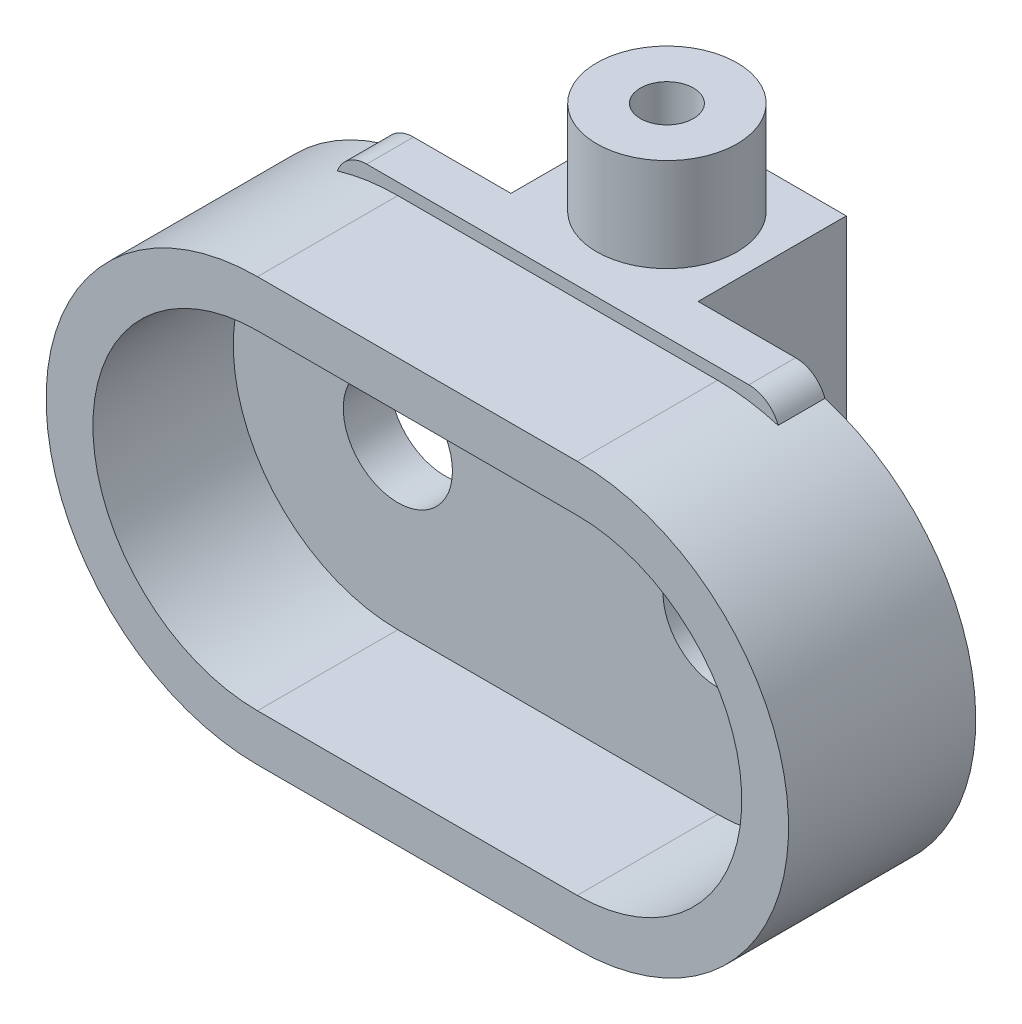
ISO-10303-21;
HEADER;
FILE_DESCRIPTION(('STEP AP214'),'2;1');
FILE_NAME('part.step','',(''),(''),'','','');
FILE_SCHEMA(('AUTOMOTIVE_DESIGN { 1 0 10303 214 1 1 1 1 }'));
ENDSEC;
DATA;
#1=APPLICATION_CONTEXT('core data for automotive mechanical design processes');
#2=APPLICATION_PROTOCOL_DEFINITION('international standard','automotive_design',2000,#1);
#3=PRODUCT_CONTEXT('',#1,'mechanical');
#4=PRODUCT('Part','Part','',(#3));
#5=PRODUCT_RELATED_PRODUCT_CATEGORY('part','',(#4));
#6=PRODUCT_DEFINITION_FORMATION('','',#4);
#7=PRODUCT_DEFINITION_CONTEXT('part definition',#1,'design');
#8=PRODUCT_DEFINITION('design','',#6,#7);
#9=PRODUCT_DEFINITION_SHAPE('','',#8);
#10=(LENGTH_UNIT() NAMED_UNIT(*) SI_UNIT(.MILLI.,.METRE.));
#11=(NAMED_UNIT(*) PLANE_ANGLE_UNIT() SI_UNIT($,.RADIAN.));
#12=(NAMED_UNIT(*) SI_UNIT($,.STERADIAN.) SOLID_ANGLE_UNIT());
#13=UNCERTAINTY_MEASURE_WITH_UNIT(LENGTH_MEASURE(1.E-05),#10,'distance_accuracy_value','');
#14=(GEOMETRIC_REPRESENTATION_CONTEXT(3) GLOBAL_UNCERTAINTY_ASSIGNED_CONTEXT((#13)) GLOBAL_UNIT_ASSIGNED_CONTEXT((#10,
#11,#12)) REPRESENTATION_CONTEXT('',''));
#15=CARTESIAN_POINT('',(0.,0.,0.));
#16=DIRECTION('',(0.,0.,1.));
#17=DIRECTION('',(1.,0.,0.));
#18=AXIS2_PLACEMENT_3D('',#15,#16,#17);
#19=CARTESIAN_POINT('',(136.,508.5,449.72));
#20=DIRECTION('',(0.,-1.,0.));
#21=DIRECTION('',(0.,0.,-1.));
#22=AXIS2_PLACEMENT_3D('',#19,#20,#21);
#23=PLANE('',#22);
#24=CARTESIAN_POINT('',(136.,508.5,449.72));
#25=DIRECTION('',(0.,-1.,0.));
#26=DIRECTION('',(1.,0.,0.));
#27=AXIS2_PLACEMENT_3D('',#24,#25,#26);
#28=CIRCLE('',#27,1.7);
#29=CARTESIAN_POINT('',(137.7,508.5,449.72));
#30=VERTEX_POINT('',#29);
#31=EDGE_CURVE('E24',#30,#30,#28,.T.);
#32=ORIENTED_EDGE('',*,*,#31,.F.);
#33=EDGE_LOOP('',(#32));
#34=FACE_BOUND('',#33,.T.);
#35=ADVANCED_FACE('F15',(#34),#23,.F.);
#36=CARTESIAN_POINT('',(136.,508.5,449.72));
#37=DIRECTION('',(0.,-1.,0.));
#38=DIRECTION('',(1.,0.,0.));
#39=AXIS2_PLACEMENT_3D('',#36,#37,#38);
#40=CYLINDRICAL_SURFACE('',#39,1.7);
#41=DIRECTION('',(0.,1.,0.));
#42=VECTOR('',#41,1.);
#43=CARTESIAN_POINT('',(137.7,508.5,449.72));
#44=LINE('',#43,#42);
#45=CARTESIAN_POINT('',(137.7,513.5,449.72));
#46=VERTEX_POINT('',#45);
#47=CARTESIAN_POINT('',(137.7,524.69,449.72));
#48=VERTEX_POINT('',#47);
#49=EDGE_CURVE('E9',#46,#48,#44,.T.);
#50=ORIENTED_EDGE('',*,*,#49,.T.);
#51=CARTESIAN_POINT('',(136.,524.69,449.72));
#52=DIRECTION('',(0.,-1.,0.));
#53=DIRECTION('',(1.,0.,0.));
#54=AXIS2_PLACEMENT_3D('',#51,#52,#53);
#55=CIRCLE('',#54,1.7);
#56=EDGE_CURVE('E161',#48,#48,#55,.T.);
#57=ORIENTED_EDGE('',*,*,#56,.F.);
#58=ORIENTED_EDGE('',*,*,#49,.F.);
#59=CARTESIAN_POINT('',(136.,513.5,449.72));
#60=DIRECTION('',(0.,-1.,0.));
#61=DIRECTION('',(1.,0.,0.));
#62=AXIS2_PLACEMENT_3D('',#59,#60,#61);
#63=CIRCLE('',#62,1.7);
#64=EDGE_CURVE('E162',#46,#46,#63,.T.);
#65=ORIENTED_EDGE('',*,*,#64,.T.);
#66=EDGE_LOOP('',(#50,#57,#58,#65));
#67=FACE_BOUND('',#66,.T.);
#68=ADVANCED_FACE('F17',(#67),#40,.F.);
#69=CARTESIAN_POINT('',(136.,508.5,449.72));
#70=DIRECTION('',(0.,-1.,0.));
#71=DIRECTION('',(1.,0.,0.));
#72=AXIS2_PLACEMENT_3D('',#69,#70,#71);
#73=CYLINDRICAL_SURFACE('',#72,1.7);
#74=CARTESIAN_POINT('',(136.,510.9,449.72));
#75=DIRECTION('',(0.,-1.,0.));
#76=DIRECTION('',(1.,0.,0.));
#77=AXIS2_PLACEMENT_3D('',#74,#75,#76);
#78=CIRCLE('',#77,1.7);
#79=CARTESIAN_POINT('',(137.7,510.9,449.72));
#80=VERTEX_POINT('',#79);
#81=EDGE_CURVE('E410',#80,#80,#78,.T.);
#82=ORIENTED_EDGE('',*,*,#81,.F.);
#83=DIRECTION('',(0.,1.,0.));
#84=VECTOR('',#83,1.);
#85=CARTESIAN_POINT('',(137.7,508.5,449.72));
#86=LINE('',#85,#84);
#87=EDGE_CURVE('E278',#30,#80,#86,.T.);
#88=ORIENTED_EDGE('',*,*,#87,.F.);
#89=ORIENTED_EDGE('',*,*,#31,.T.);
#90=ORIENTED_EDGE('',*,*,#87,.T.);
#91=EDGE_LOOP('',(#82,#88,#89,#90));
#92=FACE_BOUND('',#91,.T.);
#93=ADVANCED_FACE('F428',(#92),#73,.F.);
#94=CARTESIAN_POINT('',(133.1,510.9,453.12));
#95=DIRECTION('',(0.,0.,1.));
#96=DIRECTION('',(1.,0.,0.));
#97=AXIS2_PLACEMENT_3D('',#94,#95,#96);
#98=PLANE('',#97);
#99=DIRECTION('',(1.,0.,0.));
#100=VECTOR('',#99,1.);
#101=CARTESIAN_POINT('',(133.1,513.5,453.12));
#102=LINE('',#101,#100);
#103=CARTESIAN_POINT('',(133.1,513.5,453.12));
#104=VERTEX_POINT('',#103);
#105=CARTESIAN_POINT('',(138.9,513.5,453.12));
#106=VERTEX_POINT('',#105);
#107=EDGE_CURVE('E153',#104,#106,#102,.T.);
#108=ORIENTED_EDGE('',*,*,#107,.T.);
#109=DIRECTION('',(0.,1.,0.));
#110=VECTOR('',#109,1.);
#111=CARTESIAN_POINT('',(138.9,510.9,453.12));
#112=LINE('',#111,#110);
#113=CARTESIAN_POINT('',(138.9,510.9,453.12));
#114=VERTEX_POINT('',#113);
#115=EDGE_CURVE('E183',#114,#106,#112,.T.);
#116=ORIENTED_EDGE('',*,*,#115,.F.);
#117=DIRECTION('',(1.,0.,0.));
#118=VECTOR('',#117,1.);
#119=CARTESIAN_POINT('',(133.1,510.9,453.12));
#120=LINE('',#119,#118);
#121=CARTESIAN_POINT('',(133.1,510.9,453.12));
#122=VERTEX_POINT('',#121);
#123=EDGE_CURVE('E156',#122,#114,#120,.T.);
#124=ORIENTED_EDGE('',*,*,#123,.F.);
#125=DIRECTION('',(0.,1.,0.));
#126=VECTOR('',#125,1.);
#127=CARTESIAN_POINT('',(133.1,510.9,453.12));
#128=LINE('',#127,#126);
#129=EDGE_CURVE('E148',#122,#104,#128,.T.);
#130=ORIENTED_EDGE('',*,*,#129,.T.);
#131=EDGE_LOOP('',(#108,#116,#124,#130));
#132=FACE_BOUND('',#131,.T.);
#133=ADVANCED_FACE('F150',(#132),#98,.F.);
#134=CARTESIAN_POINT('',(146.25,504.39,456.72));
#135=DIRECTION('',(0.,0.,-1.));
#136=DIRECTION('',(1.,0.,0.));
#137=AXIS2_PLACEMENT_3D('',#134,#135,#136);
#138=CYLINDRICAL_SURFACE('',#137,10.55);
#139=CARTESIAN_POINT('',(146.25,504.39,465.72));
#140=DIRECTION('',(0.,0.,-1.));
#141=DIRECTION('',(-0.97156398104261,0.236777175294905,0.));
#142=AXIS2_PLACEMENT_3D('',#139,#140,#141);
#143=CIRCLE('',#142,10.55);
#144=CARTESIAN_POINT('',(146.25,514.94,465.72));
#145=VERTEX_POINT('',#144);
#146=CARTESIAN_POINT('',(146.25,493.84,465.72));
#147=VERTEX_POINT('',#146);
#148=EDGE_CURVE('E337',#145,#147,#143,.T.);
#149=ORIENTED_EDGE('',*,*,#148,.F.);
#150=DIRECTION('',(0.,0.,1.));
#151=VECTOR('',#150,1.);
#152=CARTESIAN_POINT('',(146.25,514.94,456.72));
#153=LINE('',#152,#151);
#154=CARTESIAN_POINT('',(146.25,514.94,456.72));
#155=VERTEX_POINT('',#154);
#156=EDGE_CURVE('E411',#155,#145,#153,.T.);
#157=ORIENTED_EDGE('',*,*,#156,.F.);
#158=CARTESIAN_POINT('',(146.25,504.39,456.72));
#159=DIRECTION('',(0.,0.,1.));
#160=DIRECTION('',(-0.97156398104261,-0.236777175294905,0.));
#161=AXIS2_PLACEMENT_3D('',#158,#159,#160);
#162=CIRCLE('',#161,10.55);
#163=CARTESIAN_POINT('',(146.25,493.84,456.72));
#164=VERTEX_POINT('',#163);
#165=EDGE_CURVE('E203',#164,#155,#162,.T.);
#166=ORIENTED_EDGE('',*,*,#165,.F.);
#167=DIRECTION('',(0.,0.,1.));
#168=VECTOR('',#167,1.);
#169=CARTESIAN_POINT('',(146.25,493.84,456.72));
#170=LINE('',#169,#168);
#171=EDGE_CURVE('E274',#164,#147,#170,.T.);
#172=ORIENTED_EDGE('',*,*,#171,.T.);
#173=EDGE_LOOP('',(#149,#157,#166,#172));
#174=FACE_BOUND('',#173,.T.);
#175=ADVANCED_FACE('F583',(#174),#138,.F.);
#176=CARTESIAN_POINT('',(125.75,493.84,456.72));
#177=DIRECTION('',(0.,1.,0.));
#178=DIRECTION('',(1.,0.,0.));
#179=AXIS2_PLACEMENT_3D('',#176,#177,#178);
#180=PLANE('',#179);
#181=ORIENTED_EDGE('',*,*,#171,.F.);
#182=DIRECTION('',(1.,0.,0.));
#183=VECTOR('',#182,1.);
#184=CARTESIAN_POINT('',(125.75,493.84,456.72));
#185=LINE('',#184,#183);
#186=CARTESIAN_POINT('',(125.75,493.84,456.72));
#187=VERTEX_POINT('',#186);
#188=EDGE_CURVE('E399',#187,#164,#185,.T.);
#189=ORIENTED_EDGE('',*,*,#188,.F.);
#190=DIRECTION('',(0.,0.,1.));
#191=VECTOR('',#190,1.);
#192=CARTESIAN_POINT('',(125.75,493.84,456.72));
#193=LINE('',#192,#191);
#194=CARTESIAN_POINT('',(125.75,493.84,465.72));
#195=VERTEX_POINT('',#194);
#196=EDGE_CURVE('E279',#187,#195,#193,.T.);
#197=ORIENTED_EDGE('',*,*,#196,.T.);
#198=DIRECTION('',(-1.,0.,0.));
#199=VECTOR('',#198,1.);
#200=CARTESIAN_POINT('',(125.75,493.84,465.72));
#201=LINE('',#200,#199);
#202=EDGE_CURVE('E389',#147,#195,#201,.T.);
#203=ORIENTED_EDGE('',*,*,#202,.F.);
#204=EDGE_LOOP('',(#181,#189,#197,#203));
#205=FACE_BOUND('',#204,.T.);
#206=ADVANCED_FACE('F586',(#205),#180,.T.);
#207=CARTESIAN_POINT('',(125.75,504.39,456.72));
#208=DIRECTION('',(0.,0.,-1.));
#209=DIRECTION('',(1.,0.,0.));
#210=AXIS2_PLACEMENT_3D('',#207,#208,#209);
#211=CYLINDRICAL_SURFACE('',#210,10.55);
#212=CARTESIAN_POINT('',(125.75,504.39,456.72));
#213=DIRECTION('',(0.,0.,1.));
#214=DIRECTION('',(1.,0.,0.));
#215=AXIS2_PLACEMENT_3D('',#212,#213,#214);
#216=CIRCLE('',#215,10.55);
#217=CARTESIAN_POINT('',(125.75,514.94,456.72));
#218=VERTEX_POINT('',#217);
#219=EDGE_CURVE('E376',#218,#187,#216,.T.);
#220=ORIENTED_EDGE('',*,*,#219,.F.);
#221=DIRECTION('',(0.,0.,1.));
#222=VECTOR('',#221,1.);
#223=CARTESIAN_POINT('',(125.75,514.94,456.72));
#224=LINE('',#223,#222);
#225=CARTESIAN_POINT('',(125.75,514.94,465.72));
#226=VERTEX_POINT('',#225);
#227=EDGE_CURVE('E414',#218,#226,#224,.T.);
#228=ORIENTED_EDGE('',*,*,#227,.T.);
#229=CARTESIAN_POINT('',(125.75,504.39,465.72));
#230=DIRECTION('',(0.,0.,-1.));
#231=DIRECTION('',(1.,0.,0.));
#232=AXIS2_PLACEMENT_3D('',#229,#230,#231);
#233=CIRCLE('',#232,10.55);
#234=EDGE_CURVE('E377',#195,#226,#233,.T.);
#235=ORIENTED_EDGE('',*,*,#234,.F.);
#236=ORIENTED_EDGE('',*,*,#196,.F.);
#237=EDGE_LOOP('',(#220,#228,#235,#236));
#238=FACE_BOUND('',#237,.T.);
#239=ADVANCED_FACE('F569',(#238),#211,.F.);
#240=CARTESIAN_POINT('',(125.75,514.94,456.72));
#241=DIRECTION('',(0.,1.,0.));
#242=DIRECTION('',(1.,0.,0.));
#243=AXIS2_PLACEMENT_3D('',#240,#241,#242);
#244=PLANE('',#243);
#245=DIRECTION('',(-1.,0.,0.));
#246=VECTOR('',#245,1.);
#247=CARTESIAN_POINT('',(125.75,514.94,465.72));
#248=LINE('',#247,#246);
#249=EDGE_CURVE('E333',#145,#226,#248,.T.);
#250=ORIENTED_EDGE('',*,*,#249,.T.);
#251=ORIENTED_EDGE('',*,*,#227,.F.);
#252=DIRECTION('',(1.,0.,0.));
#253=VECTOR('',#252,1.);
#254=CARTESIAN_POINT('',(125.75,514.94,456.72));
#255=LINE('',#254,#253);
#256=EDGE_CURVE('E372',#218,#155,#255,.T.);
#257=ORIENTED_EDGE('',*,*,#256,.T.);
#258=ORIENTED_EDGE('',*,*,#156,.T.);
#259=EDGE_LOOP('',(#250,#251,#257,#258));
#260=FACE_BOUND('',#259,.T.);
#261=ADVANCED_FACE('F579',(#260),#244,.F.);
#262=CARTESIAN_POINT('',(136.,524.69,449.72));
#263=DIRECTION('',(0.,-1.,0.));
#264=DIRECTION('',(0.,0.,-1.));
#265=AXIS2_PLACEMENT_3D('',#262,#263,#264);
#266=PLANE('',#265);
#267=ORIENTED_EDGE('',*,*,#56,.T.);
#268=EDGE_LOOP('',(#267));
#269=FACE_BOUND('',#268,.T.);
#270=CARTESIAN_POINT('',(136.,524.69,449.72));
#271=DIRECTION('',(0.,-1.,0.));
#272=DIRECTION('',(1.,0.,0.));
#273=AXIS2_PLACEMENT_3D('',#270,#271,#272);
#274=CIRCLE('',#273,4.5);
#275=CARTESIAN_POINT('',(140.5,524.69,449.72));
#276=VERTEX_POINT('',#275);
#277=EDGE_CURVE('E381',#276,#276,#274,.T.);
#278=ORIENTED_EDGE('',*,*,#277,.F.);
#279=EDGE_LOOP('',(#278));
#280=FACE_BOUND('',#279,.T.);
#281=ADVANCED_FACE('F651',(#269,#280),#266,.F.);
#282=CARTESIAN_POINT('',(133.1,510.9,409.72));
#283=DIRECTION('',(1.,0.,0.));
#284=DIRECTION('',(0.,1.,0.));
#285=AXIS2_PLACEMENT_3D('',#282,#283,#284);
#286=PLANE('',#285);
#287=DIRECTION('',(0.,0.,1.));
#288=VECTOR('',#287,1.);
#289=CARTESIAN_POINT('',(133.1,510.9,409.72));
#290=LINE('',#289,#288);
#291=CARTESIAN_POINT('',(133.1,510.9,444.22));
#292=VERTEX_POINT('',#291);
#293=EDGE_CURVE('E202',#292,#122,#290,.T.);
#294=ORIENTED_EDGE('',*,*,#293,.F.);
#295=DIRECTION('',(0.,1.,0.));
#296=VECTOR('',#295,1.);
#297=CARTESIAN_POINT('',(133.1,507.645,444.22));
#298=LINE('',#297,#296);
#299=CARTESIAN_POINT('',(133.1,513.5,444.22));
#300=VERTEX_POINT('',#299);
#301=EDGE_CURVE('E168',#292,#300,#298,.T.);
#302=ORIENTED_EDGE('',*,*,#301,.T.);
#303=DIRECTION('',(0.,0.,1.));
#304=VECTOR('',#303,1.);
#305=CARTESIAN_POINT('',(133.1,513.5,409.72));
#306=LINE('',#305,#304);
#307=EDGE_CURVE('E165',#300,#104,#306,.T.);
#308=ORIENTED_EDGE('',*,*,#307,.T.);
#309=ORIENTED_EDGE('',*,*,#129,.F.);
#310=EDGE_LOOP('',(#294,#302,#308,#309));
#311=FACE_BOUND('',#310,.T.);
#312=ADVANCED_FACE('F166',(#311),#286,.T.);
#313=CARTESIAN_POINT('',(133.1,513.5,409.72));
#314=DIRECTION('',(0.,1.,0.));
#315=DIRECTION('',(1.,0.,0.));
#316=AXIS2_PLACEMENT_3D('',#313,#314,#315);
#317=PLANE('',#316);
#318=ORIENTED_EDGE('',*,*,#64,.F.);
#319=EDGE_LOOP('',(#318));
#320=FACE_BOUND('',#319,.T.);
#321=ORIENTED_EDGE('',*,*,#107,.F.);
#322=ORIENTED_EDGE('',*,*,#307,.F.);
#323=DIRECTION('',(-1.,0.,0.));
#324=VECTOR('',#323,1.);
#325=CARTESIAN_POINT('',(131.55,513.5,444.22));
#326=LINE('',#325,#324);
#327=CARTESIAN_POINT('',(138.9,513.5,444.22));
#328=VERTEX_POINT('',#327);
#329=EDGE_CURVE('E355',#328,#300,#326,.T.);
#330=ORIENTED_EDGE('',*,*,#329,.F.);
#331=DIRECTION('',(0.,0.,1.));
#332=VECTOR('',#331,1.);
#333=CARTESIAN_POINT('',(138.9,513.5,409.72));
#334=LINE('',#333,#332);
#335=EDGE_CURVE('E175',#328,#106,#334,.T.);
#336=ORIENTED_EDGE('',*,*,#335,.T.);
#337=EDGE_LOOP('',(#321,#322,#330,#336));
#338=FACE_BOUND('',#337,.T.);
#339=ADVANCED_FACE('F174',(#320,#338),#317,.F.);
#340=CARTESIAN_POINT('',(138.9,510.9,409.72));
#341=DIRECTION('',(1.,0.,0.));
#342=DIRECTION('',(0.,1.,0.));
#343=AXIS2_PLACEMENT_3D('',#340,#341,#342);
#344=PLANE('',#343);
#345=ORIENTED_EDGE('',*,*,#115,.T.);
#346=ORIENTED_EDGE('',*,*,#335,.F.);
#347=DIRECTION('',(0.,1.,0.));
#348=VECTOR('',#347,1.);
#349=CARTESIAN_POINT('',(138.9,507.645,444.22));
#350=LINE('',#349,#348);
#351=CARTESIAN_POINT('',(138.9,510.9,444.22));
#352=VERTEX_POINT('',#351);
#353=EDGE_CURVE('E358',#352,#328,#350,.T.);
#354=ORIENTED_EDGE('',*,*,#353,.F.);
#355=DIRECTION('',(0.,0.,1.));
#356=VECTOR('',#355,1.);
#357=CARTESIAN_POINT('',(138.9,510.9,409.72));
#358=LINE('',#357,#356);
#359=EDGE_CURVE('E198',#352,#114,#358,.T.);
#360=ORIENTED_EDGE('',*,*,#359,.T.);
#361=EDGE_LOOP('',(#345,#346,#354,#360));
#362=FACE_BOUND('',#361,.T.);
#363=ADVANCED_FACE('F434',(#362),#344,.F.);
#364=CARTESIAN_POINT('',(133.1,510.9,409.72));
#365=DIRECTION('',(0.,1.,0.));
#366=DIRECTION('',(1.,0.,0.));
#367=AXIS2_PLACEMENT_3D('',#364,#365,#366);
#368=PLANE('',#367);
#369=ORIENTED_EDGE('',*,*,#81,.T.);
#370=EDGE_LOOP('',(#369));
#371=FACE_BOUND('',#370,.T.);
#372=ORIENTED_EDGE('',*,*,#359,.F.);
#373=DIRECTION('',(-1.,0.,0.));
#374=VECTOR('',#373,1.);
#375=CARTESIAN_POINT('',(131.55,510.9,444.22));
#376=LINE('',#375,#374);
#377=EDGE_CURVE('E342',#352,#292,#376,.T.);
#378=ORIENTED_EDGE('',*,*,#377,.T.);
#379=ORIENTED_EDGE('',*,*,#293,.T.);
#380=ORIENTED_EDGE('',*,*,#123,.T.);
#381=EDGE_LOOP('',(#372,#378,#379,#380));
#382=FACE_BOUND('',#381,.T.);
#383=ADVANCED_FACE('F430',(#371,#382),#368,.T.);
#384=CARTESIAN_POINT('',(125.75,504.39,456.72));
#385=DIRECTION('',(0.,0.,1.));
#386=DIRECTION('',(1.,0.,0.));
#387=AXIS2_PLACEMENT_3D('',#384,#385,#386);
#388=PLANE('',#387);
#389=ORIENTED_EDGE('',*,*,#256,.F.);
#390=ORIENTED_EDGE('',*,*,#219,.T.);
#391=ORIENTED_EDGE('',*,*,#188,.T.);
#392=ORIENTED_EDGE('',*,*,#165,.T.);
#393=EDGE_LOOP('',(#389,#390,#391,#392));
#394=FACE_BOUND('',#393,.T.);
#395=CARTESIAN_POINT('',(125.75,504.39,456.72));
#396=DIRECTION('',(0.,0.,1.));
#397=DIRECTION('',(1.,0.,0.));
#398=AXIS2_PLACEMENT_3D('',#395,#396,#397);
#399=CIRCLE('',#398,3.5);
#400=CARTESIAN_POINT('',(129.25,504.39,456.72));
#401=VERTEX_POINT('',#400);
#402=EDGE_CURVE('E285',#401,#401,#399,.T.);
#403=ORIENTED_EDGE('',*,*,#402,.F.);
#404=EDGE_LOOP('',(#403));
#405=FACE_BOUND('',#404,.T.);
#406=CARTESIAN_POINT('',(146.25,504.39,456.72));
#407=DIRECTION('',(0.,0.,1.));
#408=DIRECTION('',(1.,0.,0.));
#409=AXIS2_PLACEMENT_3D('',#406,#407,#408);
#410=CIRCLE('',#409,3.5);
#411=CARTESIAN_POINT('',(149.75,504.39,456.72));
#412=VERTEX_POINT('',#411);
#413=EDGE_CURVE('E284',#412,#412,#410,.T.);
#414=ORIENTED_EDGE('',*,*,#413,.F.);
#415=EDGE_LOOP('',(#414));
#416=FACE_BOUND('',#415,.T.);
#417=ADVANCED_FACE('F433',(#394,#405,#416),#388,.T.);
#418=CARTESIAN_POINT('',(125.75,517.94,453.72));
#419=DIRECTION('',(0.,1.,0.));
#420=DIRECTION('',(1.,0.,0.));
#421=AXIS2_PLACEMENT_3D('',#418,#419,#420);
#422=PLANE('',#421);
#423=DIRECTION('',(1.,0.,0.));
#424=VECTOR('',#423,1.);
#425=CARTESIAN_POINT('',(123.75,517.94,456.72));
#426=LINE('',#425,#424);
#427=CARTESIAN_POINT('',(125.75,517.94,456.72));
#428=VERTEX_POINT('',#427);
#429=CARTESIAN_POINT('',(146.25,517.94,456.72));
#430=VERTEX_POINT('',#429);
#431=EDGE_CURVE('E346',#428,#430,#426,.T.);
#432=ORIENTED_EDGE('',*,*,#431,.F.);
#433=DIRECTION('',(0.,0.,1.));
#434=VECTOR('',#433,1.);
#435=CARTESIAN_POINT('',(125.75,517.94,453.72));
#436=LINE('',#435,#434);
#437=CARTESIAN_POINT('',(125.75,517.94,465.72));
#438=VERTEX_POINT('',#437);
#439=EDGE_CURVE('E245',#428,#438,#436,.T.);
#440=ORIENTED_EDGE('',*,*,#439,.T.);
#441=DIRECTION('',(1.,0.,0.));
#442=VECTOR('',#441,1.);
#443=CARTESIAN_POINT('',(125.75,517.94,465.72));
#444=LINE('',#443,#442);
#445=CARTESIAN_POINT('',(146.25,517.94,465.72));
#446=VERTEX_POINT('',#445);
#447=EDGE_CURVE('E338',#438,#446,#444,.T.);
#448=ORIENTED_EDGE('',*,*,#447,.T.);
#449=DIRECTION('',(0.,0.,1.));
#450=VECTOR('',#449,1.);
#451=CARTESIAN_POINT('',(146.25,517.94,453.72));
#452=LINE('',#451,#450);
#453=EDGE_CURVE('E310',#430,#446,#452,.T.);
#454=ORIENTED_EDGE('',*,*,#453,.F.);
#455=EDGE_LOOP('',(#432,#440,#448,#454));
#456=FACE_BOUND('',#455,.T.);
#457=ADVANCED_FACE('F590',(#456),#422,.T.);
#458=CARTESIAN_POINT('',(125.75,490.84,465.72));
#459=DIRECTION('',(0.,0.,1.));
#460=DIRECTION('',(1.,0.,0.));
#461=AXIS2_PLACEMENT_3D('',#458,#459,#460);
#462=PLANE('',#461);
#463=ORIENTED_EDGE('',*,*,#249,.F.);
#464=ORIENTED_EDGE('',*,*,#148,.T.);
#465=ORIENTED_EDGE('',*,*,#202,.T.);
#466=ORIENTED_EDGE('',*,*,#234,.T.);
#467=EDGE_LOOP('',(#463,#464,#465,#466));
#468=FACE_BOUND('',#467,.T.);
#469=ORIENTED_EDGE('',*,*,#447,.F.);
#470=CARTESIAN_POINT('',(125.75,504.39,465.72));
#471=DIRECTION('',(0.,0.,1.));
#472=DIRECTION('',(1.,0.,0.));
#473=AXIS2_PLACEMENT_3D('',#470,#471,#472);
#474=CIRCLE('',#473,13.55);
#475=CARTESIAN_POINT('',(125.75,490.84,465.72));
#476=VERTEX_POINT('',#475);
#477=EDGE_CURVE('E320',#438,#476,#474,.T.);
#478=ORIENTED_EDGE('',*,*,#477,.T.);
#479=DIRECTION('',(1.,0.,0.));
#480=VECTOR('',#479,1.);
#481=CARTESIAN_POINT('',(125.75,490.84,465.72));
#482=LINE('',#481,#480);
#483=CARTESIAN_POINT('',(146.25,490.84,465.72));
#484=VERTEX_POINT('',#483);
#485=EDGE_CURVE('E330',#476,#484,#482,.T.);
#486=ORIENTED_EDGE('',*,*,#485,.T.);
#487=CARTESIAN_POINT('',(146.25,504.39,465.72));
#488=DIRECTION('',(0.,0.,-1.));
#489=DIRECTION('',(-0.75645756457588,0.654042776120896,0.));
#490=AXIS2_PLACEMENT_3D('',#487,#488,#489);
#491=CIRCLE('',#490,13.55);
#492=EDGE_CURVE('E306',#446,#484,#491,.T.);
#493=ORIENTED_EDGE('',*,*,#492,.F.);
#494=EDGE_LOOP('',(#469,#478,#486,#493));
#495=FACE_BOUND('',#494,.T.);
#496=ADVANCED_FACE('F576',(#468,#495),#462,.T.);
#497=CARTESIAN_POINT('',(136.,518.68,449.72));
#498=DIRECTION('',(0.,-1.,0.));
#499=DIRECTION('',(1.,0.,0.));
#500=AXIS2_PLACEMENT_3D('',#497,#498,#499);
#501=CYLINDRICAL_SURFACE('',#500,4.5);
#502=CARTESIAN_POINT('',(136.,518.69,449.72));
#503=DIRECTION('',(0.,-1.,0.));
#504=DIRECTION('',(1.,0.,0.));
#505=AXIS2_PLACEMENT_3D('',#502,#503,#504);
#506=CIRCLE('',#505,4.5);
#507=CARTESIAN_POINT('',(140.5,518.69,449.72));
#508=VERTEX_POINT('',#507);
#509=EDGE_CURVE('E273',#508,#508,#506,.T.);
#510=ORIENTED_EDGE('',*,*,#509,.F.);
#511=DIRECTION('',(0.,1.,0.));
#512=VECTOR('',#511,1.);
#513=CARTESIAN_POINT('',(140.5,518.68,449.72));
#514=LINE('',#513,#512);
#515=EDGE_CURVE('E371',#508,#276,#514,.T.);
#516=ORIENTED_EDGE('',*,*,#515,.T.);
#517=ORIENTED_EDGE('',*,*,#277,.T.);
#518=ORIENTED_EDGE('',*,*,#515,.F.);
#519=EDGE_LOOP('',(#510,#516,#517,#518));
#520=FACE_BOUND('',#519,.T.);
#521=ADVANCED_FACE('F631',(#520),#501,.T.);
#522=CARTESIAN_POINT('',(121.75,510.39,456.72));
#523=DIRECTION('',(0.,0.,1.));
#524=DIRECTION('',(1.,0.,0.));
#525=AXIS2_PLACEMENT_3D('',#522,#523,#524);
#526=PLANE('',#525);
#527=CARTESIAN_POINT('',(123.75,516.69,456.72));
#528=DIRECTION('',(0.,0.,-1.));
#529=DIRECTION('',(0.,-1.,0.));
#530=AXIS2_PLACEMENT_3D('',#527,#528,#529);
#531=CIRCLE('',#530,2.);
#532=CARTESIAN_POINT('',(121.87010535294,517.37263908178,456.72));
#533=VERTEX_POINT('',#532);
#534=CARTESIAN_POINT('',(123.75,518.69,456.72));
#535=VERTEX_POINT('',#534);
#536=EDGE_CURVE('E297',#533,#535,#531,.T.);
#537=ORIENTED_EDGE('',*,*,#536,.F.);
#538=CARTESIAN_POINT('',(125.75,504.39,456.72));
#539=DIRECTION('',(0.,0.,-1.));
#540=DIRECTION('',(1.,0.,0.));
#541=AXIS2_PLACEMENT_3D('',#538,#539,#540);
#542=CIRCLE('',#541,13.55);
#543=EDGE_CURVE('E240',#533,#428,#542,.T.);
#544=ORIENTED_EDGE('',*,*,#543,.T.);
#545=ORIENTED_EDGE('',*,*,#431,.T.);
#546=CARTESIAN_POINT('',(146.25,504.39,456.72));
#547=DIRECTION('',(0.,0.,-1.));
#548=DIRECTION('',(1.,0.,0.));
#549=AXIS2_PLACEMENT_3D('',#546,#547,#548);
#550=CIRCLE('',#549,13.55);
#551=CARTESIAN_POINT('',(150.12989464705,517.37263908178,456.72));
#552=VERTEX_POINT('',#551);
#553=EDGE_CURVE('E216',#430,#552,#550,.T.);
#554=ORIENTED_EDGE('',*,*,#553,.T.);
#555=CARTESIAN_POINT('',(148.25,516.69,456.72));
#556=DIRECTION('',(0.,0.,1.));
#557=DIRECTION('',(0.,-1.,0.));
#558=AXIS2_PLACEMENT_3D('',#555,#556,#557);
#559=CIRCLE('',#558,2.);
#560=CARTESIAN_POINT('',(148.25,518.69,456.72));
#561=VERTEX_POINT('',#560);
#562=EDGE_CURVE('E212',#552,#561,#559,.T.);
#563=ORIENTED_EDGE('',*,*,#562,.T.);
#564=DIRECTION('',(1.,0.,0.));
#565=VECTOR('',#564,1.);
#566=CARTESIAN_POINT('',(121.75,518.69,456.72));
#567=LINE('',#566,#565);
#568=EDGE_CURVE('E257',#535,#561,#567,.T.);
#569=ORIENTED_EDGE('',*,*,#568,.F.);
#570=EDGE_LOOP('',(#537,#544,#545,#554,#563,#569));
#571=FACE_BOUND('',#570,.T.);
#572=ADVANCED_FACE('F629',(#571),#526,.T.);
#573=CARTESIAN_POINT('',(130.,504.39,444.22));
#574=DIRECTION('',(0.,0.,1.));
#575=DIRECTION('',(1.,0.,0.));
#576=AXIS2_PLACEMENT_3D('',#573,#574,#575);
#577=PLANE('',#576);
#578=ORIENTED_EDGE('',*,*,#353,.T.);
#579=ORIENTED_EDGE('',*,*,#329,.T.);
#580=ORIENTED_EDGE('',*,*,#301,.F.);
#581=ORIENTED_EDGE('',*,*,#377,.F.);
#582=EDGE_LOOP('',(#578,#579,#580,#581));
#583=FACE_BOUND('',#582,.T.);
#584=DIRECTION('',(1.,0.,0.));
#585=VECTOR('',#584,1.);
#586=CARTESIAN_POINT('',(130.,518.69,444.22));
#587=LINE('',#586,#585);
#588=CARTESIAN_POINT('',(130.,518.69,444.22));
#589=VERTEX_POINT('',#588);
#590=CARTESIAN_POINT('',(142.,518.69,444.22));
#591=VERTEX_POINT('',#590);
#592=EDGE_CURVE('E269',#589,#591,#587,.T.);
#593=ORIENTED_EDGE('',*,*,#592,.T.);
#594=DIRECTION('',(0.,1.,0.));
#595=VECTOR('',#594,1.);
#596=CARTESIAN_POINT('',(142.,504.39,444.22));
#597=LINE('',#596,#595);
#598=CARTESIAN_POINT('',(142.,504.39,444.22));
#599=VERTEX_POINT('',#598);
#600=EDGE_CURVE('E305',#599,#591,#597,.T.);
#601=ORIENTED_EDGE('',*,*,#600,.F.);
#602=DIRECTION('',(1.,0.,0.));
#603=VECTOR('',#602,1.);
#604=CARTESIAN_POINT('',(130.,504.39,444.22));
#605=LINE('',#604,#603);
#606=CARTESIAN_POINT('',(130.,504.39,444.22));
#607=VERTEX_POINT('',#606);
#608=EDGE_CURVE('E289',#607,#599,#605,.T.);
#609=ORIENTED_EDGE('',*,*,#608,.F.);
#610=DIRECTION('',(0.,1.,0.));
#611=VECTOR('',#610,1.);
#612=CARTESIAN_POINT('',(130.,504.39,444.22));
#613=LINE('',#612,#611);
#614=EDGE_CURVE('E239',#607,#589,#613,.T.);
#615=ORIENTED_EDGE('',*,*,#614,.T.);
#616=EDGE_LOOP('',(#593,#601,#609,#615));
#617=FACE_BOUND('',#616,.T.);
#618=ADVANCED_FACE('F440',(#583,#617),#577,.F.);
#619=CARTESIAN_POINT('',(146.25,504.39,452.72));
#620=DIRECTION('',(0.,0.,-1.));
#621=DIRECTION('',(1.,0.,0.));
#622=AXIS2_PLACEMENT_3D('',#619,#620,#621);
#623=CYLINDRICAL_SURFACE('',#622,3.5);
#624=DIRECTION('',(0.,0.,1.));
#625=VECTOR('',#624,1.);
#626=CARTESIAN_POINT('',(149.75,504.39,452.72));
#627=LINE('',#626,#625);
#628=CARTESIAN_POINT('',(149.75,504.39,453.72));
#629=VERTEX_POINT('',#628);
#630=EDGE_CURVE('E280',#629,#412,#627,.T.);
#631=ORIENTED_EDGE('',*,*,#630,.F.);
#632=CARTESIAN_POINT('',(146.25,504.39,453.72));
#633=DIRECTION('',(0.,0.,-1.));
#634=DIRECTION('',(1.,0.,0.));
#635=AXIS2_PLACEMENT_3D('',#632,#633,#634);
#636=CIRCLE('',#635,3.5);
#637=EDGE_CURVE('E231',#629,#629,#636,.T.);
#638=ORIENTED_EDGE('',*,*,#637,.T.);
#639=ORIENTED_EDGE('',*,*,#630,.T.);
#640=ORIENTED_EDGE('',*,*,#413,.T.);
#641=EDGE_LOOP('',(#631,#638,#639,#640));
#642=FACE_BOUND('',#641,.T.);
#643=ADVANCED_FACE('F596',(#642),#623,.F.);
#644=CARTESIAN_POINT('',(125.75,504.39,452.72));
#645=DIRECTION('',(0.,0.,-1.));
#646=DIRECTION('',(1.,0.,0.));
#647=AXIS2_PLACEMENT_3D('',#644,#645,#646);
#648=CYLINDRICAL_SURFACE('',#647,3.5);
#649=DIRECTION('',(0.,0.,1.));
#650=VECTOR('',#649,1.);
#651=CARTESIAN_POINT('',(129.25,504.39,452.72));
#652=LINE('',#651,#650);
#653=CARTESIAN_POINT('',(129.25,504.39,453.72));
#654=VERTEX_POINT('',#653);
#655=EDGE_CURVE('E309',#654,#401,#652,.T.);
#656=ORIENTED_EDGE('',*,*,#655,.F.);
#657=CARTESIAN_POINT('',(125.75,504.39,453.72));
#658=DIRECTION('',(0.,0.,-1.));
#659=DIRECTION('',(1.,0.,0.));
#660=AXIS2_PLACEMENT_3D('',#657,#658,#659);
#661=CIRCLE('',#660,3.5);
#662=EDGE_CURVE('E230',#654,#654,#661,.T.);
#663=ORIENTED_EDGE('',*,*,#662,.T.);
#664=ORIENTED_EDGE('',*,*,#655,.T.);
#665=ORIENTED_EDGE('',*,*,#402,.T.);
#666=EDGE_LOOP('',(#656,#663,#664,#665));
#667=FACE_BOUND('',#666,.T.);
#668=ADVANCED_FACE('F604',(#667),#648,.F.);
#669=CARTESIAN_POINT('',(146.25,504.39,453.72));
#670=DIRECTION('',(0.,0.,-1.));
#671=DIRECTION('',(1.,0.,0.));
#672=AXIS2_PLACEMENT_3D('',#669,#670,#671);
#673=CYLINDRICAL_SURFACE('',#672,13.55);
#674=DIRECTION('',(0.,0.,1.));
#675=VECTOR('',#674,1.);
#676=CARTESIAN_POINT('',(146.25,490.84,453.72));
#677=LINE('',#676,#675);
#678=CARTESIAN_POINT('',(146.25,490.84,453.72));
#679=VERTEX_POINT('',#678);
#680=EDGE_CURVE('E244',#679,#484,#677,.T.);
#681=ORIENTED_EDGE('',*,*,#680,.F.);
#682=CARTESIAN_POINT('',(146.25,504.39,453.72));
#683=DIRECTION('',(0.,0.,-1.));
#684=DIRECTION('',(-0.75645756457588,0.654042776120896,0.));
#685=AXIS2_PLACEMENT_3D('',#682,#683,#684);
#686=CIRCLE('',#685,13.55);
#687=CARTESIAN_POINT('',(150.12989464705,517.37263908178,453.72));
#688=VERTEX_POINT('',#687);
#689=EDGE_CURVE('E204',#688,#679,#686,.T.);
#690=ORIENTED_EDGE('',*,*,#689,.F.);
#691=DIRECTION('',(0.,0.,-1.));
#692=VECTOR('',#691,1.);
#693=CARTESIAN_POINT('',(150.12989464705,517.37263908178,453.72));
#694=LINE('',#693,#692);
#695=EDGE_CURVE('E217',#552,#688,#694,.T.);
#696=ORIENTED_EDGE('',*,*,#695,.F.);
#697=ORIENTED_EDGE('',*,*,#553,.F.);
#698=ORIENTED_EDGE('',*,*,#453,.T.);
#699=ORIENTED_EDGE('',*,*,#492,.T.);
#700=EDGE_LOOP('',(#681,#690,#696,#697,#698,#699));
#701=FACE_BOUND('',#700,.T.);
#702=ADVANCED_FACE('F545',(#701),#673,.T.);
#703=CARTESIAN_POINT('',(148.25,516.69,453.72));
#704=DIRECTION('',(0.,0.,1.));
#705=DIRECTION('',(1.,0.,0.));
#706=AXIS2_PLACEMENT_3D('',#703,#704,#705);
#707=CYLINDRICAL_SURFACE('',#706,2.);
#708=ORIENTED_EDGE('',*,*,#695,.T.);
#709=CARTESIAN_POINT('',(148.25,516.69,453.72));
#710=DIRECTION('',(0.,0.,1.));
#711=DIRECTION('',(0.,-1.,0.));
#712=AXIS2_PLACEMENT_3D('',#709,#710,#711);
#713=CIRCLE('',#712,2.);
#714=CARTESIAN_POINT('',(148.25,518.69,453.72));
#715=VERTEX_POINT('',#714);
#716=EDGE_CURVE('E197',#688,#715,#713,.T.);
#717=ORIENTED_EDGE('',*,*,#716,.T.);
#718=DIRECTION('',(0.,0.,1.));
#719=VECTOR('',#718,1.);
#720=CARTESIAN_POINT('',(148.25,518.69,453.72));
#721=LINE('',#720,#719);
#722=EDGE_CURVE('E261',#715,#561,#721,.T.);
#723=ORIENTED_EDGE('',*,*,#722,.T.);
#724=ORIENTED_EDGE('',*,*,#562,.F.);
#725=EDGE_LOOP('',(#708,#717,#723,#724));
#726=FACE_BOUND('',#725,.T.);
#727=ADVANCED_FACE('F612',(#726),#707,.T.);
#728=CARTESIAN_POINT('',(125.75,490.84,453.72));
#729=DIRECTION('',(0.,1.,0.));
#730=DIRECTION('',(1.,0.,0.));
#731=AXIS2_PLACEMENT_3D('',#728,#729,#730);
#732=PLANE('',#731);
#733=ORIENTED_EDGE('',*,*,#680,.T.);
#734=ORIENTED_EDGE('',*,*,#485,.F.);
#735=DIRECTION('',(0.,0.,1.));
#736=VECTOR('',#735,1.);
#737=CARTESIAN_POINT('',(125.75,490.84,453.72));
#738=LINE('',#737,#736);
#739=CARTESIAN_POINT('',(125.75,490.84,453.72));
#740=VERTEX_POINT('',#739);
#741=EDGE_CURVE('E314',#740,#476,#738,.T.);
#742=ORIENTED_EDGE('',*,*,#741,.F.);
#743=DIRECTION('',(1.,0.,0.));
#744=VECTOR('',#743,1.);
#745=CARTESIAN_POINT('',(125.75,490.84,453.72));
#746=LINE('',#745,#744);
#747=EDGE_CURVE('E208',#740,#679,#746,.T.);
#748=ORIENTED_EDGE('',*,*,#747,.T.);
#749=EDGE_LOOP('',(#733,#734,#742,#748));
#750=FACE_BOUND('',#749,.T.);
#751=ADVANCED_FACE('F550',(#750),#732,.F.);
#752=CARTESIAN_POINT('',(125.75,504.39,453.72));
#753=DIRECTION('',(0.,0.,-1.));
#754=DIRECTION('',(1.,0.,0.));
#755=AXIS2_PLACEMENT_3D('',#752,#753,#754);
#756=CYLINDRICAL_SURFACE('',#755,13.55);
#757=ORIENTED_EDGE('',*,*,#741,.T.);
#758=ORIENTED_EDGE('',*,*,#477,.F.);
#759=ORIENTED_EDGE('',*,*,#439,.F.);
#760=ORIENTED_EDGE('',*,*,#543,.F.);
#761=DIRECTION('',(0.,0.,-1.));
#762=VECTOR('',#761,1.);
#763=CARTESIAN_POINT('',(121.87010535294,517.37263908178,453.72));
#764=LINE('',#763,#762);
#765=CARTESIAN_POINT('',(121.87010535294,517.37263908178,453.72));
#766=VERTEX_POINT('',#765);
#767=EDGE_CURVE('E301',#533,#766,#764,.T.);
#768=ORIENTED_EDGE('',*,*,#767,.T.);
#769=CARTESIAN_POINT('',(125.75,504.39,453.72));
#770=DIRECTION('',(0.,0.,1.));
#771=DIRECTION('',(1.,0.,0.));
#772=AXIS2_PLACEMENT_3D('',#769,#770,#771);
#773=CIRCLE('',#772,13.55);
#774=EDGE_CURVE('E187',#766,#740,#773,.T.);
#775=ORIENTED_EDGE('',*,*,#774,.T.);
#776=EDGE_LOOP('',(#757,#758,#759,#760,#768,#775));
#777=FACE_BOUND('',#776,.T.);
#778=ADVANCED_FACE('F627',(#777),#756,.T.);
#779=CARTESIAN_POINT('',(142.,504.39,444.22));
#780=DIRECTION('',(1.,0.,0.));
#781=DIRECTION('',(0.,1.,0.));
#782=AXIS2_PLACEMENT_3D('',#779,#780,#781);
#783=PLANE('',#782);
#784=DIRECTION('',(0.,0.,1.));
#785=VECTOR('',#784,1.);
#786=CARTESIAN_POINT('',(142.,504.39,444.22));
#787=LINE('',#786,#785);
#788=CARTESIAN_POINT('',(142.,504.39,453.72));
#789=VERTEX_POINT('',#788);
#790=EDGE_CURVE('E293',#599,#789,#787,.T.);
#791=ORIENTED_EDGE('',*,*,#790,.F.);
#792=ORIENTED_EDGE('',*,*,#600,.T.);
#793=DIRECTION('',(0.,0.,1.));
#794=VECTOR('',#793,1.);
#795=CARTESIAN_POINT('',(142.,518.69,444.22));
#796=LINE('',#795,#794);
#797=CARTESIAN_POINT('',(142.,518.69,453.72));
#798=VERTEX_POINT('',#797);
#799=EDGE_CURVE('E265',#591,#798,#796,.T.);
#800=ORIENTED_EDGE('',*,*,#799,.T.);
#801=DIRECTION('',(0.,1.,0.));
#802=VECTOR('',#801,1.);
#803=CARTESIAN_POINT('',(142.,504.39,453.72));
#804=LINE('',#803,#802);
#805=EDGE_CURVE('E189',#789,#798,#804,.T.);
#806=ORIENTED_EDGE('',*,*,#805,.F.);
#807=EDGE_LOOP('',(#791,#792,#800,#806));
#808=FACE_BOUND('',#807,.T.);
#809=ADVANCED_FACE('F501',(#808),#783,.T.);
#810=CARTESIAN_POINT('',(123.75,516.69,453.72));
#811=DIRECTION('',(0.,0.,1.));
#812=DIRECTION('',(-1.,0.,0.));
#813=AXIS2_PLACEMENT_3D('',#810,#811,#812);
#814=CYLINDRICAL_SURFACE('',#813,2.);
#815=ORIENTED_EDGE('',*,*,#536,.T.);
#816=DIRECTION('',(0.,0.,1.));
#817=VECTOR('',#816,1.);
#818=CARTESIAN_POINT('',(123.75,518.69,453.72));
#819=LINE('',#818,#817);
#820=CARTESIAN_POINT('',(123.75,518.69,453.72));
#821=VERTEX_POINT('',#820);
#822=EDGE_CURVE('E250',#821,#535,#819,.T.);
#823=ORIENTED_EDGE('',*,*,#822,.F.);
#824=CARTESIAN_POINT('',(123.75,516.69,453.72));
#825=DIRECTION('',(0.,0.,-1.));
#826=DIRECTION('',(0.,-1.,0.));
#827=AXIS2_PLACEMENT_3D('',#824,#825,#826);
#828=CIRCLE('',#827,2.);
#829=EDGE_CURVE('E218',#766,#821,#828,.T.);
#830=ORIENTED_EDGE('',*,*,#829,.F.);
#831=ORIENTED_EDGE('',*,*,#767,.F.);
#832=EDGE_LOOP('',(#815,#823,#830,#831));
#833=FACE_BOUND('',#832,.T.);
#834=ADVANCED_FACE('F645',(#833),#814,.T.);
#835=CARTESIAN_POINT('',(130.,504.39,444.22));
#836=DIRECTION('',(0.,1.,0.));
#837=DIRECTION('',(1.,0.,0.));
#838=AXIS2_PLACEMENT_3D('',#835,#836,#837);
#839=PLANE('',#838);
#840=DIRECTION('',(-1.,0.,0.));
#841=VECTOR('',#840,1.);
#842=CARTESIAN_POINT('',(127.875,504.39,453.72));
#843=LINE('',#842,#841);
#844=CARTESIAN_POINT('',(130.,504.39,453.72));
#845=VERTEX_POINT('',#844);
#846=EDGE_CURVE('E192',#789,#845,#843,.T.);
#847=ORIENTED_EDGE('',*,*,#846,.T.);
#848=DIRECTION('',(0.,0.,1.));
#849=VECTOR('',#848,1.);
#850=CARTESIAN_POINT('',(130.,504.39,444.22));
#851=LINE('',#850,#849);
#852=EDGE_CURVE('E246',#607,#845,#851,.T.);
#853=ORIENTED_EDGE('',*,*,#852,.F.);
#854=ORIENTED_EDGE('',*,*,#608,.T.);
#855=ORIENTED_EDGE('',*,*,#790,.T.);
#856=EDGE_LOOP('',(#847,#853,#854,#855));
#857=FACE_BOUND('',#856,.T.);
#858=ADVANCED_FACE('F506',(#857),#839,.F.);
#859=CARTESIAN_POINT('',(121.75,518.69,453.72));
#860=DIRECTION('',(0.,1.,0.));
#861=DIRECTION('',(1.,0.,0.));
#862=AXIS2_PLACEMENT_3D('',#859,#860,#861);
#863=PLANE('',#862);
#864=ORIENTED_EDGE('',*,*,#509,.T.);
#865=EDGE_LOOP('',(#864));
#866=FACE_BOUND('',#865,.T.);
#867=DIRECTION('',(1.,0.,0.));
#868=VECTOR('',#867,1.);
#869=CARTESIAN_POINT('',(121.75,518.69,453.72));
#870=LINE('',#869,#868);
#871=CARTESIAN_POINT('',(130.,518.69,453.72));
#872=VERTEX_POINT('',#871);
#873=EDGE_CURVE('E222',#821,#872,#870,.T.);
#874=ORIENTED_EDGE('',*,*,#873,.F.);
#875=ORIENTED_EDGE('',*,*,#822,.T.);
#876=ORIENTED_EDGE('',*,*,#568,.T.);
#877=ORIENTED_EDGE('',*,*,#722,.F.);
#878=DIRECTION('',(1.,0.,0.));
#879=VECTOR('',#878,1.);
#880=CARTESIAN_POINT('',(121.75,518.69,453.72));
#881=LINE('',#880,#879);
#882=EDGE_CURVE('E191',#798,#715,#881,.T.);
#883=ORIENTED_EDGE('',*,*,#882,.F.);
#884=ORIENTED_EDGE('',*,*,#799,.F.);
#885=ORIENTED_EDGE('',*,*,#592,.F.);
#886=DIRECTION('',(0.,0.,1.));
#887=VECTOR('',#886,1.);
#888=CARTESIAN_POINT('',(130.,518.69,444.22));
#889=LINE('',#888,#887);
#890=EDGE_CURVE('E235',#589,#872,#889,.T.);
#891=ORIENTED_EDGE('',*,*,#890,.T.);
#892=EDGE_LOOP('',(#874,#875,#876,#877,#883,#884,#885,#891));
#893=FACE_BOUND('',#892,.T.);
#894=ADVANCED_FACE('F515',(#866,#893),#863,.T.);
#895=CARTESIAN_POINT('',(130.,504.39,444.22));
#896=DIRECTION('',(1.,0.,0.));
#897=DIRECTION('',(0.,1.,0.));
#898=AXIS2_PLACEMENT_3D('',#895,#896,#897);
#899=PLANE('',#898);
#900=DIRECTION('',(0.,-1.,0.));
#901=VECTOR('',#900,1.);
#902=CARTESIAN_POINT('',(130.,518.69,453.72));
#903=LINE('',#902,#901);
#904=EDGE_CURVE('E226',#872,#845,#903,.T.);
#905=ORIENTED_EDGE('',*,*,#904,.F.);
#906=ORIENTED_EDGE('',*,*,#890,.F.);
#907=ORIENTED_EDGE('',*,*,#614,.F.);
#908=ORIENTED_EDGE('',*,*,#852,.T.);
#909=EDGE_LOOP('',(#905,#906,#907,#908));
#910=FACE_BOUND('',#909,.T.);
#911=ADVANCED_FACE('F512',(#910),#899,.F.);
#912=CARTESIAN_POINT('',(125.75,504.39,453.72));
#913=DIRECTION('',(0.,0.,1.));
#914=DIRECTION('',(1.,0.,0.));
#915=AXIS2_PLACEMENT_3D('',#912,#913,#914);
#916=PLANE('',#915);
#917=ORIENTED_EDGE('',*,*,#637,.F.);
#918=EDGE_LOOP('',(#917));
#919=FACE_BOUND('',#918,.T.);
#920=ORIENTED_EDGE('',*,*,#662,.F.);
#921=EDGE_LOOP('',(#920));
#922=FACE_BOUND('',#921,.T.);
#923=ORIENTED_EDGE('',*,*,#846,.F.);
#924=ORIENTED_EDGE('',*,*,#805,.T.);
#925=ORIENTED_EDGE('',*,*,#882,.T.);
#926=ORIENTED_EDGE('',*,*,#716,.F.);
#927=ORIENTED_EDGE('',*,*,#689,.T.);
#928=ORIENTED_EDGE('',*,*,#747,.F.);
#929=ORIENTED_EDGE('',*,*,#774,.F.);
#930=ORIENTED_EDGE('',*,*,#829,.T.);
#931=ORIENTED_EDGE('',*,*,#873,.T.);
#932=ORIENTED_EDGE('',*,*,#904,.T.);
#933=EDGE_LOOP('',(#923,#924,#925,#926,#927,#928,#929,#930,#931,#932));
#934=FACE_BOUND('',#933,.T.);
#935=ADVANCED_FACE('F554',(#919,#922,#934),#916,.F.);
#936=CLOSED_SHELL('',(#35,#68,#93,#133,#175,#206,#239,#261,#281,#312,#339,#363,#383,#417,#457,
#496,#521,#572,#618,#643,#668,#702,#727,#751,#778,#809,#834,#858,#894,#911,#935));
#937=MANIFOLD_SOLID_BREP('B1',#936);
#938=ADVANCED_BREP_SHAPE_REPRESENTATION('',(#18,#937),#14);
#939=SHAPE_DEFINITION_REPRESENTATION(#9,#938);
ENDSEC;
END-ISO-10303-21;
